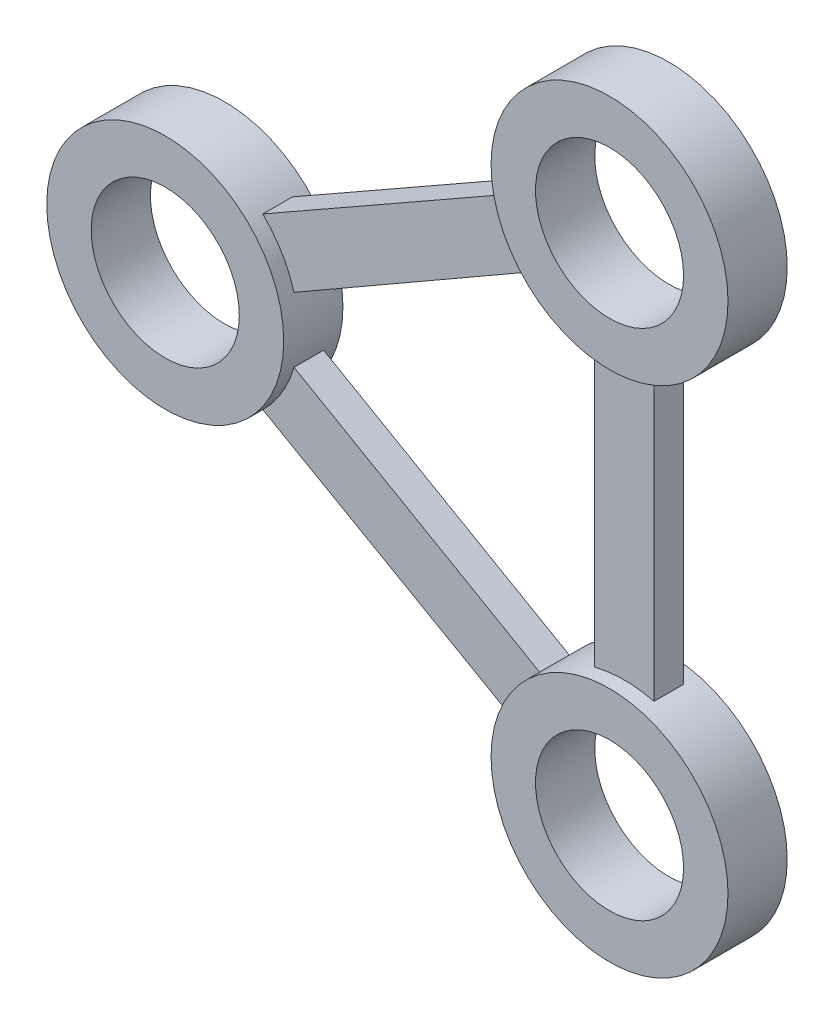
ISO-10303-21;
HEADER;
FILE_DESCRIPTION(('STEP AP214'),'2;1');
FILE_NAME('part.step','',(''),(''),'','','');
FILE_SCHEMA(('AUTOMOTIVE_DESIGN { 1 0 10303 214 1 1 1 1 }'));
ENDSEC;
DATA;
#1=APPLICATION_CONTEXT('core data for automotive mechanical design processes');
#2=APPLICATION_PROTOCOL_DEFINITION('international standard','automotive_design',2000,#1);
#3=PRODUCT_CONTEXT('',#1,'mechanical');
#4=PRODUCT('Part','Part','',(#3));
#5=PRODUCT_RELATED_PRODUCT_CATEGORY('part','',(#4));
#6=PRODUCT_DEFINITION_FORMATION('','',#4);
#7=PRODUCT_DEFINITION_CONTEXT('part definition',#1,'design');
#8=PRODUCT_DEFINITION('design','',#6,#7);
#9=PRODUCT_DEFINITION_SHAPE('','',#8);
#10=(LENGTH_UNIT() NAMED_UNIT(*) SI_UNIT(.MILLI.,.METRE.));
#11=(NAMED_UNIT(*) PLANE_ANGLE_UNIT() SI_UNIT($,.RADIAN.));
#12=(NAMED_UNIT(*) SI_UNIT($,.STERADIAN.) SOLID_ANGLE_UNIT());
#13=UNCERTAINTY_MEASURE_WITH_UNIT(LENGTH_MEASURE(1.E-05),#10,'distance_accuracy_value','');
#14=(GEOMETRIC_REPRESENTATION_CONTEXT(3) GLOBAL_UNCERTAINTY_ASSIGNED_CONTEXT((#13)) GLOBAL_UNIT_ASSIGNED_CONTEXT((#10,
#11,#12)) REPRESENTATION_CONTEXT('',''));
#15=CARTESIAN_POINT('',(0.,0.,0.));
#16=DIRECTION('',(0.,0.,1.));
#17=DIRECTION('',(1.,0.,0.));
#18=AXIS2_PLACEMENT_3D('',#15,#16,#17);
#19=CARTESIAN_POINT('',(-111.528626884144,10.9523262634289,-5.));
#20=DIRECTION('',(0.498378524628521,-0.866959541264238,0.));
#21=DIRECTION('',(0.866959541264238,0.498378524628521,0.));
#22=AXIS2_PLACEMENT_3D('',#19,#20,#21);
#23=PLANE('',#22);
#24=DIRECTION('',(0.,0.,1.));
#25=VECTOR('',#24,1.);
#26=CARTESIAN_POINT('',(-28.593413405235,58.6282873274208,-5.));
#27=LINE('',#26,#25);
#28=CARTESIAN_POINT('',(-28.593413405235,58.6282873274208,-5.));
#29=VERTEX_POINT('',#28);
#30=CARTESIAN_POINT('',(-28.593413405235,58.6282873274208,5.));
#31=VERTEX_POINT('',#30);
#32=EDGE_CURVE('E78',#29,#31,#27,.T.);
#33=ORIENTED_EDGE('',*,*,#32,.T.);
#34=DIRECTION('',(0.866959541264238,0.498378524628521,0.));
#35=VECTOR('',#34,1.);
#36=CARTESIAN_POINT('',(-111.528626884144,10.9523262634289,5.));
#37=LINE('',#36,#35);
#38=CARTESIAN_POINT('',(-111.528626884144,10.9523262634289,5.));
#39=VERTEX_POINT('',#38);
#40=EDGE_CURVE('E245',#39,#31,#37,.T.);
#41=ORIENTED_EDGE('',*,*,#40,.F.);
#42=DIRECTION('',(0.,0.,1.));
#43=VECTOR('',#42,1.);
#44=CARTESIAN_POINT('',(-111.528626884144,10.9523262634289,-5.));
#45=LINE('',#44,#43);
#46=CARTESIAN_POINT('',(-111.528626884144,10.9523262634289,-5.));
#47=VERTEX_POINT('',#46);
#48=EDGE_CURVE('E12',#47,#39,#45,.T.);
#49=ORIENTED_EDGE('',*,*,#48,.F.);
#50=DIRECTION('',(0.866959541264238,0.498378524628521,0.));
#51=VECTOR('',#50,1.);
#52=CARTESIAN_POINT('',(-111.528626884144,10.9523262634289,-5.));
#53=LINE('',#52,#51);
#54=EDGE_CURVE('E257',#47,#29,#53,.T.);
#55=ORIENTED_EDGE('',*,*,#54,.T.);
#56=EDGE_LOOP('',(#33,#41,#49,#55));
#57=FACE_BOUND('',#56,.T.);
#58=ADVANCED_FACE('F75',(#57),#23,.T.);
#59=CARTESIAN_POINT('',(-122.049730921867,28.6143750317903,-5.));
#60=DIRECTION('',(0.494798067028406,-0.869007982049045,0.));
#61=DIRECTION('',(0.869007982049045,0.494798067028406,0.));
#62=AXIS2_PLACEMENT_3D('',#59,#60,#61);
#63=PLANE('',#62);
#64=DIRECTION('',(0.,0.,1.));
#65=VECTOR('',#64,1.);
#66=CARTESIAN_POINT('',(-122.049730921867,28.6143750317903,-5.));
#67=LINE('',#66,#65);
#68=CARTESIAN_POINT('',(-122.049730921867,28.6143750317903,-5.));
#69=VERTEX_POINT('',#68);
#70=CARTESIAN_POINT('',(-122.049730921867,28.6143750317903,5.));
#71=VERTEX_POINT('',#70);
#72=EDGE_CURVE('E83',#69,#71,#67,.T.);
#73=ORIENTED_EDGE('',*,*,#72,.T.);
#74=DIRECTION('',(0.869007982049045,0.494798067028406,0.));
#75=VECTOR('',#74,1.);
#76=CARTESIAN_POINT('',(-122.049730921867,28.6143750317903,5.));
#77=LINE('',#76,#75);
#78=CARTESIAN_POINT('',(-38.6045150922567,76.1266330871241,5.));
#79=VERTEX_POINT('',#78);
#80=EDGE_CURVE('E251',#71,#79,#77,.T.);
#81=ORIENTED_EDGE('',*,*,#80,.T.);
#82=DIRECTION('',(0.,0.,1.));
#83=VECTOR('',#82,1.);
#84=CARTESIAN_POINT('',(-38.6045150922567,76.1266330871241,-5.));
#85=LINE('',#84,#83);
#86=CARTESIAN_POINT('',(-38.6045150922567,76.1266330871241,-5.));
#87=VERTEX_POINT('',#86);
#88=EDGE_CURVE('E268',#87,#79,#85,.T.);
#89=ORIENTED_EDGE('',*,*,#88,.F.);
#90=DIRECTION('',(0.869007982049045,0.494798067028406,0.));
#91=VECTOR('',#90,1.);
#92=CARTESIAN_POINT('',(-122.049730921867,28.6143750317903,-5.));
#93=LINE('',#92,#91);
#94=EDGE_CURVE('E262',#69,#87,#93,.T.);
#95=ORIENTED_EDGE('',*,*,#94,.F.);
#96=EDGE_LOOP('',(#73,#81,#89,#95));
#97=FACE_BOUND('',#96,.T.);
#98=ADVANCED_FACE('F314',(#97),#63,.F.);
#99=CARTESIAN_POINT('',(1.02695629777827E-12,86.6000000000006,-5.));
#100=DIRECTION('',(0.,0.,-1.));
#101=DIRECTION('',(-1.,0.,0.));
#102=AXIS2_PLACEMENT_3D('',#99,#100,#101);
#103=PLANE('',#102);
#104=ORIENTED_EDGE('',*,*,#54,.F.);
#105=CARTESIAN_POINT('',(-150.000000000001,-5.79397640976254E-13,-5.));
#106=DIRECTION('',(0.,0.,1.));
#107=DIRECTION('',(1.,0.,0.));
#108=AXIS2_PLACEMENT_3D('',#105,#106,#107);
#109=CIRCLE('',#108,40.0000000000011);
#110=EDGE_CURVE('E265',#47,#69,#109,.T.);
#111=ORIENTED_EDGE('',*,*,#110,.T.);
#112=ORIENTED_EDGE('',*,*,#94,.T.);
#113=CARTESIAN_POINT('',(1.02695629777827E-12,86.6000000000006,-5.));
#114=DIRECTION('',(0.,0.,-1.));
#115=DIRECTION('',(-1.,0.,0.));
#116=AXIS2_PLACEMENT_3D('',#113,#114,#115);
#117=CIRCLE('',#116,40.0000000000011);
#118=EDGE_CURVE('E260',#29,#87,#117,.T.);
#119=ORIENTED_EDGE('',*,*,#118,.F.);
#120=EDGE_LOOP('',(#104,#111,#112,#119));
#121=FACE_BOUND('',#120,.T.);
#122=ADVANCED_FACE('F284',(#121),#103,.T.);
#123=CARTESIAN_POINT('',(1.02695629777827E-12,86.6000000000006,5.));
#124=DIRECTION('',(0.,0.,-1.));
#125=DIRECTION('',(-1.,0.,0.));
#126=AXIS2_PLACEMENT_3D('',#123,#124,#125);
#127=PLANE('',#126);
#128=ORIENTED_EDGE('',*,*,#40,.T.);
#129=CARTESIAN_POINT('',(1.02695629777827E-12,86.6000000000006,5.));
#130=DIRECTION('',(0.,0.,-1.));
#131=DIRECTION('',(-1.,0.,0.));
#132=AXIS2_PLACEMENT_3D('',#129,#130,#131);
#133=CIRCLE('',#132,40.0000000000011);
#134=EDGE_CURVE('E248',#31,#79,#133,.T.);
#135=ORIENTED_EDGE('',*,*,#134,.T.);
#136=ORIENTED_EDGE('',*,*,#80,.F.);
#137=CARTESIAN_POINT('',(-150.000000000001,-5.79397640976254E-13,5.));
#138=DIRECTION('',(0.,0.,1.));
#139=DIRECTION('',(1.,0.,0.));
#140=AXIS2_PLACEMENT_3D('',#137,#138,#139);
#141=CIRCLE('',#140,40.0000000000011);
#142=EDGE_CURVE('E254',#39,#71,#141,.T.);
#143=ORIENTED_EDGE('',*,*,#142,.F.);
#144=EDGE_LOOP('',(#128,#135,#136,#143));
#145=FACE_BOUND('',#144,.T.);
#146=ADVANCED_FACE('F277',(#145),#127,.F.);
#147=CARTESIAN_POINT('',(-150.,0.,-10.));
#148=DIRECTION('',(0.,0.,1.));
#149=DIRECTION('',(1.,0.,0.));
#150=AXIS2_PLACEMENT_3D('',#147,#148,#149);
#151=CYLINDRICAL_SURFACE('',#150,40.);
#152=CARTESIAN_POINT('',(-150.,2.84494650060196E-13,-5.));
#153=DIRECTION('',(0.,0.,1.));
#154=DIRECTION('',(1.,0.,0.));
#155=AXIS2_PLACEMENT_3D('',#152,#153,#154);
#156=CIRCLE('',#155,40.0000000000005);
#157=CARTESIAN_POINT('',(-122.049730921867,-28.6143750317903,-5.));
#158=VERTEX_POINT('',#157);
#159=CARTESIAN_POINT('',(-111.528626884144,-10.9523262634289,-5.));
#160=VERTEX_POINT('',#159);
#161=EDGE_CURVE('E208',#158,#160,#156,.T.);
#162=ORIENTED_EDGE('',*,*,#161,.F.);
#163=DIRECTION('',(0.,0.,1.));
#164=VECTOR('',#163,1.);
#165=CARTESIAN_POINT('',(-122.049730921867,-28.6143750317903,-5.));
#166=LINE('',#165,#164);
#167=CARTESIAN_POINT('',(-122.049730921867,-28.6143750317903,5.));
#168=VERTEX_POINT('',#167);
#169=EDGE_CURVE('E204',#158,#168,#166,.T.);
#170=ORIENTED_EDGE('',*,*,#169,.T.);
#171=CARTESIAN_POINT('',(-150.,2.84494650060196E-13,5.));
#172=DIRECTION('',(0.,0.,1.));
#173=DIRECTION('',(1.,0.,0.));
#174=AXIS2_PLACEMENT_3D('',#171,#172,#173);
#175=CIRCLE('',#174,40.0000000000005);
#176=CARTESIAN_POINT('',(-111.528626884144,-10.9523262634288,5.));
#177=VERTEX_POINT('',#176);
#178=EDGE_CURVE('E224',#168,#177,#175,.T.);
#179=ORIENTED_EDGE('',*,*,#178,.T.);
#180=DIRECTION('',(0.,0.,1.));
#181=VECTOR('',#180,1.);
#182=CARTESIAN_POINT('',(-111.528626884144,-10.9523262634289,-5.));
#183=LINE('',#182,#181);
#184=EDGE_CURVE('E211',#160,#177,#183,.T.);
#185=ORIENTED_EDGE('',*,*,#184,.F.);
#186=EDGE_LOOP('',(#162,#170,#179,#185));
#187=FACE_BOUND('',#186,.T.);
#188=ORIENTED_EDGE('',*,*,#72,.F.);
#189=ORIENTED_EDGE('',*,*,#110,.F.);
#190=ORIENTED_EDGE('',*,*,#48,.T.);
#191=ORIENTED_EDGE('',*,*,#142,.T.);
#192=EDGE_LOOP('',(#188,#189,#190,#191));
#193=FACE_BOUND('',#192,.T.);
#194=CARTESIAN_POINT('',(-150.,0.,-10.));
#195=DIRECTION('',(0.,0.,1.));
#196=DIRECTION('',(1.,0.,0.));
#197=AXIS2_PLACEMENT_3D('',#194,#195,#196);
#198=CIRCLE('',#197,40.);
#199=CARTESIAN_POINT('',(-110.,0.,-10.));
#200=VERTEX_POINT('',#199);
#201=EDGE_CURVE('E242',#200,#200,#198,.T.);
#202=ORIENTED_EDGE('',*,*,#201,.T.);
#203=EDGE_LOOP('',(#202));
#204=FACE_BOUND('',#203,.T.);
#205=CARTESIAN_POINT('',(-150.,0.,10.));
#206=DIRECTION('',(0.,0.,1.));
#207=DIRECTION('',(1.,0.,0.));
#208=AXIS2_PLACEMENT_3D('',#205,#206,#207);
#209=CIRCLE('',#208,40.);
#210=CARTESIAN_POINT('',(-110.,0.,10.));
#211=VERTEX_POINT('',#210);
#212=EDGE_CURVE('E236',#211,#211,#209,.T.);
#213=ORIENTED_EDGE('',*,*,#212,.F.);
#214=EDGE_LOOP('',(#213));
#215=FACE_BOUND('',#214,.T.);
#216=ADVANCED_FACE('F281',(#187,#193,#204,#215),#151,.T.);
#217=CARTESIAN_POINT('',(-150.,0.,-10.));
#218=DIRECTION('',(0.,0.,1.));
#219=DIRECTION('',(1.,0.,0.));
#220=AXIS2_PLACEMENT_3D('',#217,#218,#219);
#221=PLANE('',#220);
#222=CARTESIAN_POINT('',(-150.,0.,-10.));
#223=DIRECTION('',(0.,0.,1.));
#224=DIRECTION('',(1.,0.,0.));
#225=AXIS2_PLACEMENT_3D('',#222,#223,#224);
#226=CIRCLE('',#225,25.);
#227=CARTESIAN_POINT('',(-125.,0.,-10.));
#228=VERTEX_POINT('',#227);
#229=EDGE_CURVE('E239',#228,#228,#226,.T.);
#230=ORIENTED_EDGE('',*,*,#229,.T.);
#231=EDGE_LOOP('',(#230));
#232=FACE_BOUND('',#231,.T.);
#233=ORIENTED_EDGE('',*,*,#201,.F.);
#234=EDGE_LOOP('',(#233));
#235=FACE_BOUND('',#234,.T.);
#236=ADVANCED_FACE('F328',(#232,#235),#221,.F.);
#237=CARTESIAN_POINT('',(-150.,0.,-10.));
#238=DIRECTION('',(0.,0.,1.));
#239=DIRECTION('',(1.,0.,0.));
#240=AXIS2_PLACEMENT_3D('',#237,#238,#239);
#241=CYLINDRICAL_SURFACE('',#240,25.);
#242=ORIENTED_EDGE('',*,*,#229,.F.);
#243=EDGE_LOOP('',(#242));
#244=FACE_BOUND('',#243,.T.);
#245=CARTESIAN_POINT('',(-150.,0.,10.));
#246=DIRECTION('',(0.,0.,1.));
#247=DIRECTION('',(1.,0.,0.));
#248=AXIS2_PLACEMENT_3D('',#245,#246,#247);
#249=CIRCLE('',#248,25.);
#250=CARTESIAN_POINT('',(-125.,0.,10.));
#251=VERTEX_POINT('',#250);
#252=EDGE_CURVE('E233',#251,#251,#249,.T.);
#253=ORIENTED_EDGE('',*,*,#252,.T.);
#254=EDGE_LOOP('',(#253));
#255=FACE_BOUND('',#254,.T.);
#256=ADVANCED_FACE('F332',(#244,#255),#241,.F.);
#257=CARTESIAN_POINT('',(-150.,0.,10.));
#258=DIRECTION('',(0.,0.,1.));
#259=DIRECTION('',(1.,0.,0.));
#260=AXIS2_PLACEMENT_3D('',#257,#258,#259);
#261=PLANE('',#260);
#262=ORIENTED_EDGE('',*,*,#212,.T.);
#263=EDGE_LOOP('',(#262));
#264=FACE_BOUND('',#263,.T.);
#265=ORIENTED_EDGE('',*,*,#252,.F.);
#266=EDGE_LOOP('',(#265));
#267=FACE_BOUND('',#266,.T.);
#268=ADVANCED_FACE('F336',(#264,#267),#261,.T.);
#269=CARTESIAN_POINT('',(-122.049730921867,-28.6143750317903,-5.));
#270=DIRECTION('',(-0.494798067028406,-0.869007982049045,0.));
#271=DIRECTION('',(0.869007982049045,-0.494798067028406,0.));
#272=AXIS2_PLACEMENT_3D('',#269,#270,#271);
#273=PLANE('',#272);
#274=DIRECTION('',(0.,0.,1.));
#275=VECTOR('',#274,1.);
#276=CARTESIAN_POINT('',(-38.6045150922567,-76.1266330871241,-5.));
#277=LINE('',#276,#275);
#278=CARTESIAN_POINT('',(-38.6045150922567,-76.1266330871241,-5.));
#279=VERTEX_POINT('',#278);
#280=CARTESIAN_POINT('',(-38.6045150922567,-76.1266330871241,5.));
#281=VERTEX_POINT('',#280);
#282=EDGE_CURVE('E205',#279,#281,#277,.T.);
#283=ORIENTED_EDGE('',*,*,#282,.T.);
#284=DIRECTION('',(0.869007982049045,-0.494798067028406,0.));
#285=VECTOR('',#284,1.);
#286=CARTESIAN_POINT('',(-122.049730921867,-28.6143750317903,5.));
#287=LINE('',#286,#285);
#288=EDGE_CURVE('E230',#168,#281,#287,.T.);
#289=ORIENTED_EDGE('',*,*,#288,.F.);
#290=ORIENTED_EDGE('',*,*,#169,.F.);
#291=DIRECTION('',(0.869007982049045,-0.494798067028406,0.));
#292=VECTOR('',#291,1.);
#293=CARTESIAN_POINT('',(-122.049730921867,-28.6143750317903,-5.));
#294=LINE('',#293,#292);
#295=EDGE_CURVE('E221',#158,#279,#294,.T.);
#296=ORIENTED_EDGE('',*,*,#295,.T.);
#297=EDGE_LOOP('',(#283,#289,#290,#296));
#298=FACE_BOUND('',#297,.T.);
#299=ADVANCED_FACE('F340',(#298),#273,.T.);
#300=CARTESIAN_POINT('',(-111.528626884144,-10.9523262634289,-5.));
#301=DIRECTION('',(-0.498378524628521,-0.866959541264238,0.));
#302=DIRECTION('',(0.866959541264238,-0.498378524628521,0.));
#303=AXIS2_PLACEMENT_3D('',#300,#301,#302);
#304=PLANE('',#303);
#305=ORIENTED_EDGE('',*,*,#184,.T.);
#306=DIRECTION('',(0.866959541264238,-0.498378524628521,0.));
#307=VECTOR('',#306,1.);
#308=CARTESIAN_POINT('',(-111.528626884144,-10.9523262634289,5.));
#309=LINE('',#308,#307);
#310=CARTESIAN_POINT('',(-28.593413405235,-58.6282873274208,5.));
#311=VERTEX_POINT('',#310);
#312=EDGE_CURVE('E99',#177,#311,#309,.T.);
#313=ORIENTED_EDGE('',*,*,#312,.T.);
#314=DIRECTION('',(0.,0.,1.));
#315=VECTOR('',#314,1.);
#316=CARTESIAN_POINT('',(-28.593413405235,-58.6282873274208,-5.));
#317=LINE('',#316,#315);
#318=CARTESIAN_POINT('',(-28.593413405235,-58.6282873274208,-5.));
#319=VERTEX_POINT('',#318);
#320=EDGE_CURVE('E209',#319,#311,#317,.T.);
#321=ORIENTED_EDGE('',*,*,#320,.F.);
#322=DIRECTION('',(0.866959541264238,-0.498378524628521,0.));
#323=VECTOR('',#322,1.);
#324=CARTESIAN_POINT('',(-111.528626884144,-10.9523262634289,-5.));
#325=LINE('',#324,#323);
#326=EDGE_CURVE('E216',#160,#319,#325,.T.);
#327=ORIENTED_EDGE('',*,*,#326,.F.);
#328=EDGE_LOOP('',(#305,#313,#321,#327));
#329=FACE_BOUND('',#328,.T.);
#330=ADVANCED_FACE('F347',(#329),#304,.F.);
#331=CARTESIAN_POINT('',(2.4500541664918E-06,-86.6000014017177,-5.));
#332=DIRECTION('',(0.,0.,-1.));
#333=DIRECTION('',(-1.,0.,0.));
#334=AXIS2_PLACEMENT_3D('',#331,#332,#333);
#335=PLANE('',#334);
#336=ORIENTED_EDGE('',*,*,#295,.F.);
#337=ORIENTED_EDGE('',*,*,#161,.T.);
#338=ORIENTED_EDGE('',*,*,#326,.T.);
#339=CARTESIAN_POINT('',(2.4500541664918E-06,-86.6000014017177,-5.));
#340=DIRECTION('',(0.,0.,-1.));
#341=DIRECTION('',(-1.,0.,0.));
#342=AXIS2_PLACEMENT_3D('',#339,#340,#341);
#343=CIRCLE('',#342,40.0000027315964);
#344=EDGE_CURVE('E219',#279,#319,#343,.T.);
#345=ORIENTED_EDGE('',*,*,#344,.F.);
#346=EDGE_LOOP('',(#336,#337,#338,#345));
#347=FACE_BOUND('',#346,.T.);
#348=ADVANCED_FACE('F344',(#347),#335,.T.);
#349=CARTESIAN_POINT('',(2.4500541664918E-06,-86.6000014017177,5.));
#350=DIRECTION('',(0.,0.,-1.));
#351=DIRECTION('',(-1.,0.,0.));
#352=AXIS2_PLACEMENT_3D('',#349,#350,#351);
#353=PLANE('',#352);
#354=ORIENTED_EDGE('',*,*,#288,.T.);
#355=CARTESIAN_POINT('',(2.4500541664918E-06,-86.6000014017177,5.));
#356=DIRECTION('',(0.,0.,-1.));
#357=DIRECTION('',(-1.,0.,0.));
#358=AXIS2_PLACEMENT_3D('',#355,#356,#357);
#359=CIRCLE('',#358,40.0000027315964);
#360=EDGE_CURVE('E228',#281,#311,#359,.T.);
#361=ORIENTED_EDGE('',*,*,#360,.T.);
#362=ORIENTED_EDGE('',*,*,#312,.F.);
#363=ORIENTED_EDGE('',*,*,#178,.F.);
#364=EDGE_LOOP('',(#354,#361,#362,#363));
#365=FACE_BOUND('',#364,.T.);
#366=ADVANCED_FACE('F290',(#365),#353,.F.);
#367=CARTESIAN_POINT('',(0.,86.6,-10.));
#368=DIRECTION('',(0.,0.,1.));
#369=DIRECTION('',(1.,0.,0.));
#370=AXIS2_PLACEMENT_3D('',#367,#368,#369);
#371=CYLINDRICAL_SURFACE('',#370,40.);
#372=CARTESIAN_POINT('',(0.,86.5999999999997,-5.));
#373=DIRECTION('',(0.,0.,1.));
#374=DIRECTION('',(1.,0.,0.));
#375=AXIS2_PLACEMENT_3D('',#372,#373,#374);
#376=CIRCLE('',#375,39.9999999999997);
#377=CARTESIAN_POINT('',(-10.,47.8701665379259,-5.));
#378=VERTEX_POINT('',#377);
#379=CARTESIAN_POINT('',(10.,47.8701665379258,-5.));
#380=VERTEX_POINT('',#379);
#381=EDGE_CURVE('E183',#378,#380,#376,.T.);
#382=ORIENTED_EDGE('',*,*,#381,.F.);
#383=DIRECTION('',(0.,0.,1.));
#384=VECTOR('',#383,1.);
#385=CARTESIAN_POINT('',(-10.,47.8701665379259,-5.));
#386=LINE('',#385,#384);
#387=CARTESIAN_POINT('',(-10.,47.8701665379259,5.));
#388=VERTEX_POINT('',#387);
#389=EDGE_CURVE('E399',#378,#388,#386,.T.);
#390=ORIENTED_EDGE('',*,*,#389,.T.);
#391=CARTESIAN_POINT('',(0.,86.5999999999997,5.));
#392=DIRECTION('',(0.,0.,1.));
#393=DIRECTION('',(1.,0.,0.));
#394=AXIS2_PLACEMENT_3D('',#391,#392,#393);
#395=CIRCLE('',#394,39.9999999999997);
#396=CARTESIAN_POINT('',(10.,47.8701665379258,5.));
#397=VERTEX_POINT('',#396);
#398=EDGE_CURVE('E187',#388,#397,#395,.T.);
#399=ORIENTED_EDGE('',*,*,#398,.T.);
#400=DIRECTION('',(0.,0.,1.));
#401=VECTOR('',#400,1.);
#402=CARTESIAN_POINT('',(10.,47.8701665379258,-5.));
#403=LINE('',#402,#401);
#404=EDGE_CURVE('E400',#380,#397,#403,.T.);
#405=ORIENTED_EDGE('',*,*,#404,.F.);
#406=EDGE_LOOP('',(#382,#390,#399,#405));
#407=FACE_BOUND('',#406,.T.);
#408=ORIENTED_EDGE('',*,*,#32,.F.);
#409=ORIENTED_EDGE('',*,*,#118,.T.);
#410=ORIENTED_EDGE('',*,*,#88,.T.);
#411=ORIENTED_EDGE('',*,*,#134,.F.);
#412=EDGE_LOOP('',(#408,#409,#410,#411));
#413=FACE_BOUND('',#412,.T.);
#414=CARTESIAN_POINT('',(0.,86.6,-10.));
#415=DIRECTION('',(0.,0.,1.));
#416=DIRECTION('',(1.,0.,0.));
#417=AXIS2_PLACEMENT_3D('',#414,#415,#416);
#418=CIRCLE('',#417,40.);
#419=CARTESIAN_POINT('',(40.,86.6,-10.));
#420=VERTEX_POINT('',#419);
#421=EDGE_CURVE('E189',#420,#420,#418,.T.);
#422=ORIENTED_EDGE('',*,*,#421,.T.);
#423=EDGE_LOOP('',(#422));
#424=FACE_BOUND('',#423,.T.);
#425=CARTESIAN_POINT('',(0.,86.6,10.));
#426=DIRECTION('',(0.,0.,1.));
#427=DIRECTION('',(1.,0.,0.));
#428=AXIS2_PLACEMENT_3D('',#425,#426,#427);
#429=CIRCLE('',#428,40.);
#430=CARTESIAN_POINT('',(40.,86.6,10.));
#431=VERTEX_POINT('',#430);
#432=EDGE_CURVE('E198',#431,#431,#429,.T.);
#433=ORIENTED_EDGE('',*,*,#432,.F.);
#434=EDGE_LOOP('',(#433));
#435=FACE_BOUND('',#434,.T.);
#436=ADVANCED_FACE('F286',(#407,#413,#424,#435),#371,.T.);
#437=CARTESIAN_POINT('',(0.,86.6,-10.));
#438=DIRECTION('',(0.,0.,1.));
#439=DIRECTION('',(1.,0.,0.));
#440=AXIS2_PLACEMENT_3D('',#437,#438,#439);
#441=PLANE('',#440);
#442=CARTESIAN_POINT('',(0.,86.6,-10.));
#443=DIRECTION('',(0.,0.,1.));
#444=DIRECTION('',(1.,0.,0.));
#445=AXIS2_PLACEMENT_3D('',#442,#443,#444);
#446=CIRCLE('',#445,25.);
#447=CARTESIAN_POINT('',(25.,86.6,-10.));
#448=VERTEX_POINT('',#447);
#449=EDGE_CURVE('E192',#448,#448,#446,.T.);
#450=ORIENTED_EDGE('',*,*,#449,.T.);
#451=EDGE_LOOP('',(#450));
#452=FACE_BOUND('',#451,.T.);
#453=ORIENTED_EDGE('',*,*,#421,.F.);
#454=EDGE_LOOP('',(#453));
#455=FACE_BOUND('',#454,.T.);
#456=ADVANCED_FACE('F289',(#452,#455),#441,.F.);
#457=CARTESIAN_POINT('',(0.,86.6,-10.));
#458=DIRECTION('',(0.,0.,1.));
#459=DIRECTION('',(1.,0.,0.));
#460=AXIS2_PLACEMENT_3D('',#457,#458,#459);
#461=CYLINDRICAL_SURFACE('',#460,25.);
#462=ORIENTED_EDGE('',*,*,#449,.F.);
#463=EDGE_LOOP('',(#462));
#464=FACE_BOUND('',#463,.T.);
#465=CARTESIAN_POINT('',(0.,86.6,10.));
#466=DIRECTION('',(0.,0.,1.));
#467=DIRECTION('',(1.,0.,0.));
#468=AXIS2_PLACEMENT_3D('',#465,#466,#467);
#469=CIRCLE('',#468,25.);
#470=CARTESIAN_POINT('',(25.,86.6,10.));
#471=VERTEX_POINT('',#470);
#472=EDGE_CURVE('E201',#471,#471,#469,.T.);
#473=ORIENTED_EDGE('',*,*,#472,.T.);
#474=EDGE_LOOP('',(#473));
#475=FACE_BOUND('',#474,.T.);
#476=ADVANCED_FACE('F300',(#464,#475),#461,.F.);
#477=CARTESIAN_POINT('',(0.,86.6,10.));
#478=DIRECTION('',(0.,0.,1.));
#479=DIRECTION('',(1.,0.,0.));
#480=AXIS2_PLACEMENT_3D('',#477,#478,#479);
#481=PLANE('',#480);
#482=ORIENTED_EDGE('',*,*,#432,.T.);
#483=EDGE_LOOP('',(#482));
#484=FACE_BOUND('',#483,.T.);
#485=ORIENTED_EDGE('',*,*,#472,.F.);
#486=EDGE_LOOP('',(#485));
#487=FACE_BOUND('',#486,.T.);
#488=ADVANCED_FACE('F297',(#484,#487),#481,.T.);
#489=CARTESIAN_POINT('',(-10.,47.8701665379259,-5.));
#490=DIRECTION('',(-1.,0.,0.));
#491=DIRECTION('',(0.,-1.,0.));
#492=AXIS2_PLACEMENT_3D('',#489,#490,#491);
#493=PLANE('',#492);
#494=DIRECTION('',(0.,0.,1.));
#495=VECTOR('',#494,1.);
#496=CARTESIAN_POINT('',(-10.,-47.8701665379257,-5.));
#497=LINE('',#496,#495);
#498=CARTESIAN_POINT('',(-10.,-47.8701665379258,-5.));
#499=VERTEX_POINT('',#498);
#500=CARTESIAN_POINT('',(-10.,-47.8701665379258,5.));
#501=VERTEX_POINT('',#500);
#502=EDGE_CURVE('E171',#499,#501,#497,.T.);
#503=ORIENTED_EDGE('',*,*,#502,.T.);
#504=DIRECTION('',(0.,-1.,0.));
#505=VECTOR('',#504,1.);
#506=CARTESIAN_POINT('',(-10.,47.8701665379259,5.));
#507=LINE('',#506,#505);
#508=EDGE_CURVE('E176',#388,#501,#507,.T.);
#509=ORIENTED_EDGE('',*,*,#508,.F.);
#510=ORIENTED_EDGE('',*,*,#389,.F.);
#511=DIRECTION('',(0.,-1.,0.));
#512=VECTOR('',#511,1.);
#513=CARTESIAN_POINT('',(-10.,47.8701665379259,-5.));
#514=LINE('',#513,#512);
#515=EDGE_CURVE('E182',#378,#499,#514,.T.);
#516=ORIENTED_EDGE('',*,*,#515,.T.);
#517=EDGE_LOOP('',(#503,#509,#510,#516));
#518=FACE_BOUND('',#517,.T.);
#519=ADVANCED_FACE('F180',(#518),#493,.T.);
#520=CARTESIAN_POINT('',(10.,47.8701665379258,-5.));
#521=DIRECTION('',(-1.,0.,0.));
#522=DIRECTION('',(0.,-1.,0.));
#523=AXIS2_PLACEMENT_3D('',#520,#521,#522);
#524=PLANE('',#523);
#525=ORIENTED_EDGE('',*,*,#404,.T.);
#526=DIRECTION('',(0.,-1.,0.));
#527=VECTOR('',#526,1.);
#528=CARTESIAN_POINT('',(10.,47.8701665379258,5.));
#529=LINE('',#528,#527);
#530=CARTESIAN_POINT('',(10.,-47.8701665379258,5.));
#531=VERTEX_POINT('',#530);
#532=EDGE_CURVE('E91',#397,#531,#529,.T.);
#533=ORIENTED_EDGE('',*,*,#532,.T.);
#534=DIRECTION('',(0.,0.,1.));
#535=VECTOR('',#534,1.);
#536=CARTESIAN_POINT('',(10.,-47.8701665379258,-5.));
#537=LINE('',#536,#535);
#538=CARTESIAN_POINT('',(10.,-47.8701665379258,-5.));
#539=VERTEX_POINT('',#538);
#540=EDGE_CURVE('E174',#539,#531,#537,.T.);
#541=ORIENTED_EDGE('',*,*,#540,.F.);
#542=DIRECTION('',(0.,-1.,0.));
#543=VECTOR('',#542,1.);
#544=CARTESIAN_POINT('',(10.,47.8701665379258,-5.));
#545=LINE('',#544,#543);
#546=EDGE_CURVE('E401',#380,#539,#545,.T.);
#547=ORIENTED_EDGE('',*,*,#546,.F.);
#548=EDGE_LOOP('',(#525,#533,#541,#547));
#549=FACE_BOUND('',#548,.T.);
#550=ADVANCED_FACE('F385',(#549),#524,.F.);
#551=CARTESIAN_POINT('',(-2.14993764247473E-13,-86.6000000000018,-5.));
#552=DIRECTION('',(0.,0.,-1.));
#553=DIRECTION('',(-1.,0.,0.));
#554=AXIS2_PLACEMENT_3D('',#551,#552,#553);
#555=PLANE('',#554);
#556=ORIENTED_EDGE('',*,*,#515,.F.);
#557=ORIENTED_EDGE('',*,*,#381,.T.);
#558=ORIENTED_EDGE('',*,*,#546,.T.);
#559=CARTESIAN_POINT('',(-2.14993764247473E-13,-86.6000000000018,-5.));
#560=DIRECTION('',(0.,0.,-1.));
#561=DIRECTION('',(-1.,0.,0.));
#562=AXIS2_PLACEMENT_3D('',#559,#560,#561);
#563=CIRCLE('',#562,40.0000000000018);
#564=EDGE_CURVE('E396',#499,#539,#563,.T.);
#565=ORIENTED_EDGE('',*,*,#564,.F.);
#566=EDGE_LOOP('',(#556,#557,#558,#565));
#567=FACE_BOUND('',#566,.T.);
#568=ADVANCED_FACE('F373',(#567),#555,.T.);
#569=CARTESIAN_POINT('',(-2.14993764247473E-13,-86.6000000000018,5.));
#570=DIRECTION('',(0.,0.,-1.));
#571=DIRECTION('',(-1.,0.,0.));
#572=AXIS2_PLACEMENT_3D('',#569,#570,#571);
#573=PLANE('',#572);
#574=ORIENTED_EDGE('',*,*,#508,.T.);
#575=CARTESIAN_POINT('',(-2.14993764247473E-13,-86.6000000000018,5.));
#576=DIRECTION('',(0.,0.,-1.));
#577=DIRECTION('',(-1.,0.,0.));
#578=AXIS2_PLACEMENT_3D('',#575,#576,#577);
#579=CIRCLE('',#578,40.0000000000018);
#580=EDGE_CURVE('E167',#501,#531,#579,.T.);
#581=ORIENTED_EDGE('',*,*,#580,.T.);
#582=ORIENTED_EDGE('',*,*,#532,.F.);
#583=ORIENTED_EDGE('',*,*,#398,.F.);
#584=EDGE_LOOP('',(#574,#581,#582,#583));
#585=FACE_BOUND('',#584,.T.);
#586=ADVANCED_FACE('F185',(#585),#573,.F.);
#587=CARTESIAN_POINT('',(0.,-86.6,-10.));
#588=DIRECTION('',(0.,0.,1.));
#589=DIRECTION('',(1.,0.,0.));
#590=AXIS2_PLACEMENT_3D('',#587,#588,#589);
#591=CYLINDRICAL_SURFACE('',#590,40.);
#592=ORIENTED_EDGE('',*,*,#282,.F.);
#593=ORIENTED_EDGE('',*,*,#344,.T.);
#594=ORIENTED_EDGE('',*,*,#320,.T.);
#595=ORIENTED_EDGE('',*,*,#360,.F.);
#596=EDGE_LOOP('',(#592,#593,#594,#595));
#597=FACE_BOUND('',#596,.T.);
#598=ORIENTED_EDGE('',*,*,#502,.F.);
#599=ORIENTED_EDGE('',*,*,#564,.T.);
#600=ORIENTED_EDGE('',*,*,#540,.T.);
#601=ORIENTED_EDGE('',*,*,#580,.F.);
#602=EDGE_LOOP('',(#598,#599,#600,#601));
#603=FACE_BOUND('',#602,.T.);
#604=CARTESIAN_POINT('',(0.,-86.6,-10.));
#605=DIRECTION('',(0.,0.,1.));
#606=DIRECTION('',(1.,0.,0.));
#607=AXIS2_PLACEMENT_3D('',#604,#605,#606);
#608=CIRCLE('',#607,40.);
#609=CARTESIAN_POINT('',(40.,-86.6,-10.));
#610=VERTEX_POINT('',#609);
#611=EDGE_CURVE('E419',#610,#610,#608,.T.);
#612=ORIENTED_EDGE('',*,*,#611,.T.);
#613=EDGE_LOOP('',(#612));
#614=FACE_BOUND('',#613,.T.);
#615=CARTESIAN_POINT('',(0.,-86.6,10.));
#616=DIRECTION('',(0.,0.,1.));
#617=DIRECTION('',(1.,0.,0.));
#618=AXIS2_PLACEMENT_3D('',#615,#616,#617);
#619=CIRCLE('',#618,40.);
#620=CARTESIAN_POINT('',(40.,-86.6,10.));
#621=VERTEX_POINT('',#620);
#622=EDGE_CURVE('E413',#621,#621,#619,.T.);
#623=ORIENTED_EDGE('',*,*,#622,.F.);
#624=EDGE_LOOP('',(#623));
#625=FACE_BOUND('',#624,.T.);
#626=ADVANCED_FACE('F169',(#597,#603,#614,#625),#591,.T.);
#627=CARTESIAN_POINT('',(0.,-86.6,-10.));
#628=DIRECTION('',(0.,0.,1.));
#629=DIRECTION('',(1.,0.,0.));
#630=AXIS2_PLACEMENT_3D('',#627,#628,#629);
#631=PLANE('',#630);
#632=CARTESIAN_POINT('',(0.,-86.6,-10.));
#633=DIRECTION('',(0.,0.,1.));
#634=DIRECTION('',(1.,0.,0.));
#635=AXIS2_PLACEMENT_3D('',#632,#633,#634);
#636=CIRCLE('',#635,25.);
#637=CARTESIAN_POINT('',(25.,-86.6,-10.));
#638=VERTEX_POINT('',#637);
#639=EDGE_CURVE('E416',#638,#638,#636,.T.);
#640=ORIENTED_EDGE('',*,*,#639,.T.);
#641=EDGE_LOOP('',(#640));
#642=FACE_BOUND('',#641,.T.);
#643=ORIENTED_EDGE('',*,*,#611,.F.);
#644=EDGE_LOOP('',(#643));
#645=FACE_BOUND('',#644,.T.);
#646=ADVANCED_FACE('F364',(#642,#645),#631,.F.);
#647=CARTESIAN_POINT('',(0.,-86.6,-10.));
#648=DIRECTION('',(0.,0.,1.));
#649=DIRECTION('',(1.,0.,0.));
#650=AXIS2_PLACEMENT_3D('',#647,#648,#649);
#651=CYLINDRICAL_SURFACE('',#650,25.);
#652=ORIENTED_EDGE('',*,*,#639,.F.);
#653=EDGE_LOOP('',(#652));
#654=FACE_BOUND('',#653,.T.);
#655=CARTESIAN_POINT('',(0.,-86.6,10.));
#656=DIRECTION('',(0.,0.,1.));
#657=DIRECTION('',(1.,0.,0.));
#658=AXIS2_PLACEMENT_3D('',#655,#656,#657);
#659=CIRCLE('',#658,25.);
#660=CARTESIAN_POINT('',(25.,-86.6,10.));
#661=VERTEX_POINT('',#660);
#662=EDGE_CURVE('E409',#661,#661,#659,.T.);
#663=ORIENTED_EDGE('',*,*,#662,.T.);
#664=EDGE_LOOP('',(#663));
#665=FACE_BOUND('',#664,.T.);
#666=ADVANCED_FACE('F370',(#654,#665),#651,.F.);
#667=CARTESIAN_POINT('',(0.,-86.6,10.));
#668=DIRECTION('',(0.,0.,1.));
#669=DIRECTION('',(1.,0.,0.));
#670=AXIS2_PLACEMENT_3D('',#667,#668,#669);
#671=PLANE('',#670);
#672=ORIENTED_EDGE('',*,*,#622,.T.);
#673=EDGE_LOOP('',(#672));
#674=FACE_BOUND('',#673,.T.);
#675=ORIENTED_EDGE('',*,*,#662,.F.);
#676=EDGE_LOOP('',(#675));
#677=FACE_BOUND('',#676,.T.);
#678=ADVANCED_FACE('F378',(#674,#677),#671,.T.);
#679=CLOSED_SHELL('',(#58,#98,#122,#146,#216,#236,#256,#268,#299,#330,#348,#366,#436,#456,#476,
#488,#519,#550,#568,#586,#626,#646,#666,#678));
#680=MANIFOLD_SOLID_BREP('B2',#679);
#681=ADVANCED_BREP_SHAPE_REPRESENTATION('',(#18,#680),#14);
#682=SHAPE_DEFINITION_REPRESENTATION(#9,#681);
ENDSEC;
END-ISO-10303-21;
